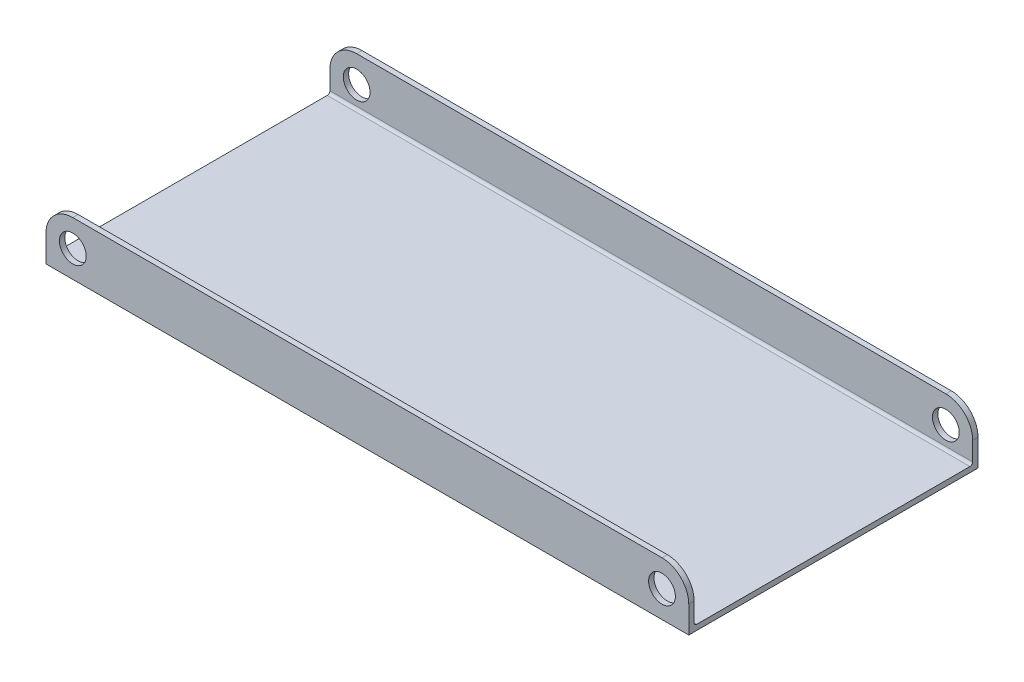
ISO-10303-21;
HEADER;
FILE_DESCRIPTION(('STEP AP214'),'2;1');
FILE_NAME('part.step','',(''),(''),'','','');
FILE_SCHEMA(('AUTOMOTIVE_DESIGN { 1 0 10303 214 1 1 1 1 }'));
ENDSEC;
DATA;
#1=APPLICATION_CONTEXT('core data for automotive mechanical design processes');
#2=APPLICATION_PROTOCOL_DEFINITION('international standard','automotive_design',2000,#1);
#3=PRODUCT_CONTEXT('',#1,'mechanical');
#4=PRODUCT('Part','Part','',(#3));
#5=PRODUCT_RELATED_PRODUCT_CATEGORY('part','',(#4));
#6=PRODUCT_DEFINITION_FORMATION('','',#4);
#7=PRODUCT_DEFINITION_CONTEXT('part definition',#1,'design');
#8=PRODUCT_DEFINITION('design','',#6,#7);
#9=PRODUCT_DEFINITION_SHAPE('','',#8);
#10=(LENGTH_UNIT() NAMED_UNIT(*) SI_UNIT(.MILLI.,.METRE.));
#11=(NAMED_UNIT(*) PLANE_ANGLE_UNIT() SI_UNIT($,.RADIAN.));
#12=(NAMED_UNIT(*) SI_UNIT($,.STERADIAN.) SOLID_ANGLE_UNIT());
#13=UNCERTAINTY_MEASURE_WITH_UNIT(LENGTH_MEASURE(1.E-05),#10,'distance_accuracy_value','');
#14=(GEOMETRIC_REPRESENTATION_CONTEXT(3) GLOBAL_UNCERTAINTY_ASSIGNED_CONTEXT((#13)) GLOBAL_UNIT_ASSIGNED_CONTEXT((#10,
#11,#12)) REPRESENTATION_CONTEXT('',''));
#15=CARTESIAN_POINT('',(0.,0.,0.));
#16=DIRECTION('',(0.,0.,1.));
#17=DIRECTION('',(1.,0.,0.));
#18=AXIS2_PLACEMENT_3D('',#15,#16,#17);
#19=CARTESIAN_POINT('',(0.,12.7,0.));
#20=DIRECTION('',(0.,1.,0.));
#21=DIRECTION('',(0.,0.,1.));
#22=AXIS2_PLACEMENT_3D('',#19,#20,#21);
#23=PLANE('',#22);
#24=DIRECTION('',(1.,0.,0.));
#25=VECTOR('',#24,1.);
#26=CARTESIAN_POINT('',(0.,12.7,-33.02));
#27=LINE('',#26,#25);
#28=CARTESIAN_POINT('',(-69.8499999999999,12.7,-33.02));
#29=VERTEX_POINT('',#28);
#30=CARTESIAN_POINT('',(69.85,12.7,-33.02));
#31=VERTEX_POINT('',#30);
#32=EDGE_CURVE('E176',#29,#31,#27,.T.);
#33=ORIENTED_EDGE('',*,*,#32,.T.);
#34=DIRECTION('',(0.,0.,1.));
#35=VECTOR('',#34,1.);
#36=CARTESIAN_POINT('',(69.85,12.7,-34.29));
#37=LINE('',#36,#35);
#38=CARTESIAN_POINT('',(69.85,12.7,-34.29));
#39=VERTEX_POINT('',#38);
#40=EDGE_CURVE('E160',#39,#31,#37,.T.);
#41=ORIENTED_EDGE('',*,*,#40,.F.);
#42=DIRECTION('',(-1.,0.,0.));
#43=VECTOR('',#42,1.);
#44=CARTESIAN_POINT('',(-76.2,12.7,-34.29));
#45=LINE('',#44,#43);
#46=CARTESIAN_POINT('',(-69.8499999999999,12.7,-34.29));
#47=VERTEX_POINT('',#46);
#48=EDGE_CURVE('E173',#39,#47,#45,.T.);
#49=ORIENTED_EDGE('',*,*,#48,.T.);
#50=DIRECTION('',(0.,0.,1.));
#51=VECTOR('',#50,1.);
#52=CARTESIAN_POINT('',(-69.8499999999999,12.7,-34.29));
#53=LINE('',#52,#51);
#54=EDGE_CURVE('E274',#47,#29,#53,.T.);
#55=ORIENTED_EDGE('',*,*,#54,.T.);
#56=EDGE_LOOP('',(#33,#41,#49,#55));
#57=FACE_BOUND('',#56,.T.);
#58=ADVANCED_FACE('F57',(#57),#23,.T.);
#59=CARTESIAN_POINT('',(-76.2,12.7,-34.29));
#60=DIRECTION('',(0.,0.,1.));
#61=DIRECTION('',(1.,0.,0.));
#62=AXIS2_PLACEMENT_3D('',#59,#60,#61);
#63=PLANE('',#62);
#64=ORIENTED_EDGE('',*,*,#48,.F.);
#65=CARTESIAN_POINT('',(69.85,6.35,-34.29));
#66=DIRECTION('',(0.,0.,1.));
#67=DIRECTION('',(1.,0.,0.));
#68=AXIS2_PLACEMENT_3D('',#65,#66,#67);
#69=CIRCLE('',#68,6.35);
#70=CARTESIAN_POINT('',(76.2,6.34999999999995,-34.29));
#71=VERTEX_POINT('',#70);
#72=EDGE_CURVE('E156',#39,#71,#69,.F.);
#73=ORIENTED_EDGE('',*,*,#72,.T.);
#74=DIRECTION('',(0.,-1.,0.));
#75=VECTOR('',#74,1.);
#76=CARTESIAN_POINT('',(76.2,12.7,-34.29));
#77=LINE('',#76,#75);
#78=CARTESIAN_POINT('',(76.2,0.,-34.29));
#79=VERTEX_POINT('',#78);
#80=EDGE_CURVE('E210',#71,#79,#77,.T.);
#81=ORIENTED_EDGE('',*,*,#80,.T.);
#82=DIRECTION('',(-1.,0.,0.));
#83=VECTOR('',#82,1.);
#84=CARTESIAN_POINT('',(-76.2,0.,-34.29));
#85=LINE('',#84,#83);
#86=CARTESIAN_POINT('',(-76.2,0.,-34.29));
#87=VERTEX_POINT('',#86);
#88=EDGE_CURVE('E199',#79,#87,#85,.T.);
#89=ORIENTED_EDGE('',*,*,#88,.T.);
#90=DIRECTION('',(0.,-1.,0.));
#91=VECTOR('',#90,1.);
#92=CARTESIAN_POINT('',(-76.2,12.7,-34.29));
#93=LINE('',#92,#91);
#94=CARTESIAN_POINT('',(-76.2,6.34999999999995,-34.29));
#95=VERTEX_POINT('',#94);
#96=EDGE_CURVE('E208',#95,#87,#93,.T.);
#97=ORIENTED_EDGE('',*,*,#96,.F.);
#98=CARTESIAN_POINT('',(-69.85,6.35,-34.29));
#99=DIRECTION('',(0.,0.,1.));
#100=DIRECTION('',(1.,0.,0.));
#101=AXIS2_PLACEMENT_3D('',#98,#99,#100);
#102=CIRCLE('',#101,6.35);
#103=EDGE_CURVE('E182',#47,#95,#102,.T.);
#104=ORIENTED_EDGE('',*,*,#103,.F.);
#105=EDGE_LOOP('',(#64,#73,#81,#89,#97,#104));
#106=FACE_BOUND('',#105,.T.);
#107=CARTESIAN_POINT('',(69.85,6.35,-34.29));
#108=DIRECTION('',(0.,0.,1.));
#109=DIRECTION('',(1.,0.,0.));
#110=AXIS2_PLACEMENT_3D('',#107,#108,#109);
#111=CIRCLE('',#110,3.17500000000005);
#112=CARTESIAN_POINT('',(73.0250000000001,6.35,-34.29));
#113=VERTEX_POINT('',#112);
#114=EDGE_CURVE('E295',#113,#113,#111,.F.);
#115=ORIENTED_EDGE('',*,*,#114,.F.);
#116=EDGE_LOOP('',(#115));
#117=FACE_BOUND('',#116,.T.);
#118=CARTESIAN_POINT('',(-69.85,6.35,-34.29));
#119=DIRECTION('',(0.,0.,1.));
#120=DIRECTION('',(1.,0.,0.));
#121=AXIS2_PLACEMENT_3D('',#118,#119,#120);
#122=CIRCLE('',#121,3.175);
#123=CARTESIAN_POINT('',(-66.675,6.35,-34.29));
#124=VERTEX_POINT('',#123);
#125=EDGE_CURVE('E291',#124,#124,#122,.T.);
#126=ORIENTED_EDGE('',*,*,#125,.T.);
#127=EDGE_LOOP('',(#126));
#128=FACE_BOUND('',#127,.T.);
#129=ADVANCED_FACE('F179',(#106,#117,#128),#63,.F.);
#130=CARTESIAN_POINT('',(-76.2,12.7,34.29));
#131=DIRECTION('',(0.,0.,-1.));
#132=DIRECTION('',(-1.,0.,0.));
#133=AXIS2_PLACEMENT_3D('',#130,#131,#132);
#134=PLANE('',#133);
#135=DIRECTION('',(0.,-1.,0.));
#136=VECTOR('',#135,1.);
#137=CARTESIAN_POINT('',(76.2,12.7,34.29));
#138=LINE('',#137,#136);
#139=CARTESIAN_POINT('',(76.2,6.34999999999995,34.29));
#140=VERTEX_POINT('',#139);
#141=CARTESIAN_POINT('',(76.2,0.,34.29));
#142=VERTEX_POINT('',#141);
#143=EDGE_CURVE('E187',#140,#142,#138,.T.);
#144=ORIENTED_EDGE('',*,*,#143,.F.);
#145=CARTESIAN_POINT('',(69.85,6.35,34.29));
#146=DIRECTION('',(0.,0.,1.));
#147=DIRECTION('',(1.,0.,0.));
#148=AXIS2_PLACEMENT_3D('',#145,#146,#147);
#149=CIRCLE('',#148,6.35);
#150=CARTESIAN_POINT('',(69.85,12.7,34.29));
#151=VERTEX_POINT('',#150);
#152=EDGE_CURVE('E168',#151,#140,#149,.F.);
#153=ORIENTED_EDGE('',*,*,#152,.F.);
#154=DIRECTION('',(1.,0.,0.));
#155=VECTOR('',#154,1.);
#156=CARTESIAN_POINT('',(-76.2,12.7,34.29));
#157=LINE('',#156,#155);
#158=CARTESIAN_POINT('',(-69.8499999999999,12.7,34.29));
#159=VERTEX_POINT('',#158);
#160=EDGE_CURVE('E183',#159,#151,#157,.T.);
#161=ORIENTED_EDGE('',*,*,#160,.F.);
#162=CARTESIAN_POINT('',(-69.85,6.35,34.29));
#163=DIRECTION('',(0.,0.,1.));
#164=DIRECTION('',(1.,0.,0.));
#165=AXIS2_PLACEMENT_3D('',#162,#163,#164);
#166=CIRCLE('',#165,6.35);
#167=CARTESIAN_POINT('',(-76.2,6.34999999999995,34.29));
#168=VERTEX_POINT('',#167);
#169=EDGE_CURVE('E279',#159,#168,#166,.T.);
#170=ORIENTED_EDGE('',*,*,#169,.T.);
#171=DIRECTION('',(0.,-1.,0.));
#172=VECTOR('',#171,1.);
#173=CARTESIAN_POINT('',(-76.2,12.7,34.29));
#174=LINE('',#173,#172);
#175=CARTESIAN_POINT('',(-76.2,0.,34.29));
#176=VERTEX_POINT('',#175);
#177=EDGE_CURVE('E206',#168,#176,#174,.T.);
#178=ORIENTED_EDGE('',*,*,#177,.T.);
#179=DIRECTION('',(1.,0.,0.));
#180=VECTOR('',#179,1.);
#181=CARTESIAN_POINT('',(-76.2,0.,34.29));
#182=LINE('',#181,#180);
#183=EDGE_CURVE('E184',#176,#142,#182,.T.);
#184=ORIENTED_EDGE('',*,*,#183,.T.);
#185=EDGE_LOOP('',(#144,#153,#161,#170,#178,#184));
#186=FACE_BOUND('',#185,.T.);
#187=CARTESIAN_POINT('',(69.85,6.35,34.29));
#188=DIRECTION('',(0.,0.,1.));
#189=DIRECTION('',(1.,0.,0.));
#190=AXIS2_PLACEMENT_3D('',#187,#188,#189);
#191=CIRCLE('',#190,3.17500000000005);
#192=CARTESIAN_POINT('',(73.0250000000001,6.35,34.29));
#193=VERTEX_POINT('',#192);
#194=EDGE_CURVE('E292',#193,#193,#191,.F.);
#195=ORIENTED_EDGE('',*,*,#194,.T.);
#196=EDGE_LOOP('',(#195));
#197=FACE_BOUND('',#196,.T.);
#198=CARTESIAN_POINT('',(-69.85,6.35,34.29));
#199=DIRECTION('',(0.,0.,1.));
#200=DIRECTION('',(1.,0.,0.));
#201=AXIS2_PLACEMENT_3D('',#198,#199,#200);
#202=CIRCLE('',#201,3.175);
#203=CARTESIAN_POINT('',(-66.675,6.35,34.29));
#204=VERTEX_POINT('',#203);
#205=EDGE_CURVE('E297',#204,#204,#202,.T.);
#206=ORIENTED_EDGE('',*,*,#205,.F.);
#207=EDGE_LOOP('',(#206));
#208=FACE_BOUND('',#207,.T.);
#209=ADVANCED_FACE('F331',(#186,#197,#208),#134,.F.);
#210=ORIENTED_EDGE('',*,*,#160,.T.);
#211=CARTESIAN_POINT('',(69.85,12.7,33.02));
#212=VERTEX_POINT('',#211);
#213=EDGE_CURVE('E167',#212,#151,#37,.T.);
#214=ORIENTED_EDGE('',*,*,#213,.F.);
#215=DIRECTION('',(1.,0.,0.));
#216=VECTOR('',#215,1.);
#217=CARTESIAN_POINT('',(0.,12.7,33.02));
#218=LINE('',#217,#216);
#219=CARTESIAN_POINT('',(-69.8499999999999,12.7,33.02));
#220=VERTEX_POINT('',#219);
#221=EDGE_CURVE('E267',#220,#212,#218,.T.);
#222=ORIENTED_EDGE('',*,*,#221,.F.);
#223=EDGE_CURVE('E277',#220,#159,#53,.T.);
#224=ORIENTED_EDGE('',*,*,#223,.T.);
#225=EDGE_LOOP('',(#210,#214,#222,#224));
#226=FACE_BOUND('',#225,.T.);
#227=ADVANCED_FACE('F327',(#226),#23,.T.);
#228=CARTESIAN_POINT('',(0.,1.27,-33.02));
#229=DIRECTION('',(0.,0.,1.));
#230=DIRECTION('',(1.,0.,0.));
#231=AXIS2_PLACEMENT_3D('',#228,#229,#230);
#232=PLANE('',#231);
#233=CARTESIAN_POINT('',(69.85,6.35,-33.02));
#234=DIRECTION('',(0.,0.,1.));
#235=DIRECTION('',(1.,0.,0.));
#236=AXIS2_PLACEMENT_3D('',#233,#234,#235);
#237=CIRCLE('',#236,3.17500000000005);
#238=CARTESIAN_POINT('',(73.0250000000001,6.35,-33.02));
#239=VERTEX_POINT('',#238);
#240=EDGE_CURVE('E222',#239,#239,#237,.F.);
#241=ORIENTED_EDGE('',*,*,#240,.T.);
#242=EDGE_LOOP('',(#241));
#243=FACE_BOUND('',#242,.T.);
#244=DIRECTION('',(0.,1.,0.));
#245=VECTOR('',#244,1.);
#246=CARTESIAN_POINT('',(-76.2,1.27,-33.02));
#247=LINE('',#246,#245);
#248=CARTESIAN_POINT('',(-76.2,1.905,-33.02));
#249=VERTEX_POINT('',#248);
#250=CARTESIAN_POINT('',(-76.2,6.34999999999995,-33.02));
#251=VERTEX_POINT('',#250);
#252=EDGE_CURVE('E193',#249,#251,#247,.T.);
#253=ORIENTED_EDGE('',*,*,#252,.F.);
#254=DIRECTION('',(1.,0.,0.));
#255=VECTOR('',#254,1.);
#256=CARTESIAN_POINT('',(76.2,1.905,-33.02));
#257=LINE('',#256,#255);
#258=CARTESIAN_POINT('',(76.2,1.905,-33.02));
#259=VERTEX_POINT('',#258);
#260=EDGE_CURVE('E234',#249,#259,#257,.T.);
#261=ORIENTED_EDGE('',*,*,#260,.T.);
#262=DIRECTION('',(0.,1.,0.));
#263=VECTOR('',#262,1.);
#264=CARTESIAN_POINT('',(76.2,1.27,-33.02));
#265=LINE('',#264,#263);
#266=CARTESIAN_POINT('',(76.2,6.35,-33.02));
#267=VERTEX_POINT('',#266);
#268=EDGE_CURVE('E200',#259,#267,#265,.T.);
#269=ORIENTED_EDGE('',*,*,#268,.T.);
#270=CARTESIAN_POINT('',(69.85,6.35,-33.02));
#271=DIRECTION('',(0.,0.,1.));
#272=DIRECTION('',(1.,0.,0.));
#273=AXIS2_PLACEMENT_3D('',#270,#271,#272);
#274=CIRCLE('',#273,6.35);
#275=EDGE_CURVE('E223',#31,#267,#274,.F.);
#276=ORIENTED_EDGE('',*,*,#275,.F.);
#277=ORIENTED_EDGE('',*,*,#32,.F.);
#278=CARTESIAN_POINT('',(-69.85,6.35,-33.02));
#279=DIRECTION('',(0.,0.,1.));
#280=DIRECTION('',(1.,0.,0.));
#281=AXIS2_PLACEMENT_3D('',#278,#279,#280);
#282=CIRCLE('',#281,6.35);
#283=EDGE_CURVE('E256',#29,#251,#282,.T.);
#284=ORIENTED_EDGE('',*,*,#283,.T.);
#285=EDGE_LOOP('',(#253,#261,#269,#276,#277,#284));
#286=FACE_BOUND('',#285,.T.);
#287=CARTESIAN_POINT('',(-69.85,6.35,-33.02));
#288=DIRECTION('',(0.,0.,1.));
#289=DIRECTION('',(1.,0.,0.));
#290=AXIS2_PLACEMENT_3D('',#287,#288,#289);
#291=CIRCLE('',#290,3.175);
#292=CARTESIAN_POINT('',(-66.675,6.35,-33.02));
#293=VERTEX_POINT('',#292);
#294=EDGE_CURVE('E227',#293,#293,#291,.T.);
#295=ORIENTED_EDGE('',*,*,#294,.F.);
#296=EDGE_LOOP('',(#295));
#297=FACE_BOUND('',#296,.T.);
#298=ADVANCED_FACE('F253',(#243,#286,#297),#232,.T.);
#299=CARTESIAN_POINT('',(0.,1.27,33.02));
#300=DIRECTION('',(0.,0.,1.));
#301=DIRECTION('',(1.,0.,0.));
#302=AXIS2_PLACEMENT_3D('',#299,#300,#301);
#303=PLANE('',#302);
#304=DIRECTION('',(0.,1.,0.));
#305=VECTOR('',#304,1.);
#306=CARTESIAN_POINT('',(76.2,1.27,33.02));
#307=LINE('',#306,#305);
#308=CARTESIAN_POINT('',(76.2,1.905,33.02));
#309=VERTEX_POINT('',#308);
#310=CARTESIAN_POINT('',(76.2,6.34999999999995,33.02));
#311=VERTEX_POINT('',#310);
#312=EDGE_CURVE('E260',#309,#311,#307,.T.);
#313=ORIENTED_EDGE('',*,*,#312,.F.);
#314=DIRECTION('',(1.,0.,0.));
#315=VECTOR('',#314,1.);
#316=CARTESIAN_POINT('',(0.,1.905,33.02));
#317=LINE('',#316,#315);
#318=CARTESIAN_POINT('',(-76.2,1.905,33.02));
#319=VERTEX_POINT('',#318);
#320=EDGE_CURVE('E232',#309,#319,#317,.F.);
#321=ORIENTED_EDGE('',*,*,#320,.T.);
#322=DIRECTION('',(0.,1.,0.));
#323=VECTOR('',#322,1.);
#324=CARTESIAN_POINT('',(-76.2,1.27,33.02));
#325=LINE('',#324,#323);
#326=CARTESIAN_POINT('',(-76.2,6.34999999999995,33.02));
#327=VERTEX_POINT('',#326);
#328=EDGE_CURVE('E259',#319,#327,#325,.T.);
#329=ORIENTED_EDGE('',*,*,#328,.T.);
#330=CARTESIAN_POINT('',(-69.85,6.35,33.02));
#331=DIRECTION('',(0.,0.,1.));
#332=DIRECTION('',(1.,0.,0.));
#333=AXIS2_PLACEMENT_3D('',#330,#331,#332);
#334=CIRCLE('',#333,6.35);
#335=EDGE_CURVE('E212',#220,#327,#334,.T.);
#336=ORIENTED_EDGE('',*,*,#335,.F.);
#337=ORIENTED_EDGE('',*,*,#221,.T.);
#338=CARTESIAN_POINT('',(69.85,6.35,33.02));
#339=DIRECTION('',(0.,0.,1.));
#340=DIRECTION('',(1.,0.,0.));
#341=AXIS2_PLACEMENT_3D('',#338,#339,#340);
#342=CIRCLE('',#341,6.35);
#343=EDGE_CURVE('E288',#212,#311,#342,.F.);
#344=ORIENTED_EDGE('',*,*,#343,.T.);
#345=EDGE_LOOP('',(#313,#321,#329,#336,#337,#344));
#346=FACE_BOUND('',#345,.T.);
#347=CARTESIAN_POINT('',(69.85,6.35,33.02));
#348=DIRECTION('',(0.,0.,1.));
#349=DIRECTION('',(1.,0.,0.));
#350=AXIS2_PLACEMENT_3D('',#347,#348,#349);
#351=CIRCLE('',#350,3.17500000000005);
#352=CARTESIAN_POINT('',(73.0250000000001,6.35,33.02));
#353=VERTEX_POINT('',#352);
#354=EDGE_CURVE('E219',#353,#353,#351,.F.);
#355=ORIENTED_EDGE('',*,*,#354,.F.);
#356=EDGE_LOOP('',(#355));
#357=FACE_BOUND('',#356,.T.);
#358=CARTESIAN_POINT('',(-69.85,6.35,33.02));
#359=DIRECTION('',(0.,0.,1.));
#360=DIRECTION('',(1.,0.,0.));
#361=AXIS2_PLACEMENT_3D('',#358,#359,#360);
#362=CIRCLE('',#361,3.175);
#363=CARTESIAN_POINT('',(-66.675,6.35,33.02));
#364=VERTEX_POINT('',#363);
#365=EDGE_CURVE('E224',#364,#364,#362,.T.);
#366=ORIENTED_EDGE('',*,*,#365,.T.);
#367=EDGE_LOOP('',(#366));
#368=FACE_BOUND('',#367,.T.);
#369=ADVANCED_FACE('F341',(#346,#357,#368),#303,.F.);
#370=CARTESIAN_POINT('',(76.2,12.7,-34.29));
#371=DIRECTION('',(-1.,0.,0.));
#372=DIRECTION('',(0.,0.,1.));
#373=AXIS2_PLACEMENT_3D('',#370,#371,#372);
#374=PLANE('',#373);
#375=DIRECTION('',(0.,0.,1.));
#376=VECTOR('',#375,1.);
#377=CARTESIAN_POINT('',(76.2,6.35,-34.29));
#378=LINE('',#377,#376);
#379=EDGE_CURVE('E215',#140,#311,#378,.F.);
#380=ORIENTED_EDGE('',*,*,#379,.F.);
#381=ORIENTED_EDGE('',*,*,#143,.T.);
#382=DIRECTION('',(0.,0.,-1.));
#383=VECTOR('',#382,1.);
#384=CARTESIAN_POINT('',(76.2,0.,-34.29));
#385=LINE('',#384,#383);
#386=EDGE_CURVE('E196',#142,#79,#385,.T.);
#387=ORIENTED_EDGE('',*,*,#386,.T.);
#388=ORIENTED_EDGE('',*,*,#80,.F.);
#389=DIRECTION('',(0.,0.,1.));
#390=VECTOR('',#389,1.);
#391=CARTESIAN_POINT('',(76.2,6.34999999999995,-34.29));
#392=LINE('',#391,#390);
#393=EDGE_CURVE('E163',#71,#267,#392,.T.);
#394=ORIENTED_EDGE('',*,*,#393,.T.);
#395=ORIENTED_EDGE('',*,*,#268,.F.);
#396=CARTESIAN_POINT('',(76.2,1.905,-32.385));
#397=DIRECTION('',(-1.,0.,0.));
#398=DIRECTION('',(0.,0.,1.));
#399=AXIS2_PLACEMENT_3D('',#396,#397,#398);
#400=CIRCLE('',#399,0.635);
#401=CARTESIAN_POINT('',(76.2,1.27,-32.385));
#402=VERTEX_POINT('',#401);
#403=EDGE_CURVE('E65',#259,#402,#400,.T.);
#404=ORIENTED_EDGE('',*,*,#403,.T.);
#405=DIRECTION('',(0.,0.,-1.));
#406=VECTOR('',#405,1.);
#407=CARTESIAN_POINT('',(76.2,1.27,0.));
#408=LINE('',#407,#406);
#409=CARTESIAN_POINT('',(76.2,1.27,32.385));
#410=VERTEX_POINT('',#409);
#411=EDGE_CURVE('E245',#410,#402,#408,.T.);
#412=ORIENTED_EDGE('',*,*,#411,.F.);
#413=CARTESIAN_POINT('',(76.2,1.905,32.385));
#414=DIRECTION('',(-1.,0.,0.));
#415=DIRECTION('',(0.,0.,1.));
#416=AXIS2_PLACEMENT_3D('',#413,#414,#415);
#417=CIRCLE('',#416,0.635);
#418=EDGE_CURVE('E236',#410,#309,#417,.T.);
#419=ORIENTED_EDGE('',*,*,#418,.T.);
#420=ORIENTED_EDGE('',*,*,#312,.T.);
#421=EDGE_LOOP('',(#380,#381,#387,#388,#394,#395,#404,#412,#419,#420));
#422=FACE_BOUND('',#421,.T.);
#423=ADVANCED_FACE('F244',(#422),#374,.F.);
#424=CARTESIAN_POINT('',(-76.2,12.7,-34.29));
#425=DIRECTION('',(1.,0.,0.));
#426=DIRECTION('',(0.,0.,-1.));
#427=AXIS2_PLACEMENT_3D('',#424,#425,#426);
#428=PLANE('',#427);
#429=DIRECTION('',(0.,0.,1.));
#430=VECTOR('',#429,1.);
#431=CARTESIAN_POINT('',(-76.2,6.34999999999995,-34.29));
#432=LINE('',#431,#430);
#433=EDGE_CURVE('E273',#95,#251,#432,.T.);
#434=ORIENTED_EDGE('',*,*,#433,.F.);
#435=ORIENTED_EDGE('',*,*,#96,.T.);
#436=DIRECTION('',(0.,0.,1.));
#437=VECTOR('',#436,1.);
#438=CARTESIAN_POINT('',(-76.2,0.,-34.29));
#439=LINE('',#438,#437);
#440=EDGE_CURVE('E190',#87,#176,#439,.T.);
#441=ORIENTED_EDGE('',*,*,#440,.T.);
#442=ORIENTED_EDGE('',*,*,#177,.F.);
#443=EDGE_CURVE('E276',#327,#168,#432,.T.);
#444=ORIENTED_EDGE('',*,*,#443,.F.);
#445=ORIENTED_EDGE('',*,*,#328,.F.);
#446=CARTESIAN_POINT('',(-76.2,1.905,32.385));
#447=DIRECTION('',(1.,0.,0.));
#448=DIRECTION('',(0.,0.,-1.));
#449=AXIS2_PLACEMENT_3D('',#446,#447,#448);
#450=CIRCLE('',#449,0.635);
#451=CARTESIAN_POINT('',(-76.2,1.27,32.385));
#452=VERTEX_POINT('',#451);
#453=EDGE_CURVE('E238',#319,#452,#450,.T.);
#454=ORIENTED_EDGE('',*,*,#453,.T.);
#455=DIRECTION('',(0.,0.,1.));
#456=VECTOR('',#455,1.);
#457=CARTESIAN_POINT('',(-76.2,1.27,0.));
#458=LINE('',#457,#456);
#459=CARTESIAN_POINT('',(-76.2,1.27,-32.385));
#460=VERTEX_POINT('',#459);
#461=EDGE_CURVE('E250',#460,#452,#458,.T.);
#462=ORIENTED_EDGE('',*,*,#461,.F.);
#463=CARTESIAN_POINT('',(-76.2,1.905,-32.385));
#464=DIRECTION('',(1.,0.,0.));
#465=DIRECTION('',(0.,0.,-1.));
#466=AXIS2_PLACEMENT_3D('',#463,#464,#465);
#467=CIRCLE('',#466,0.635);
#468=EDGE_CURVE('E12',#460,#249,#467,.T.);
#469=ORIENTED_EDGE('',*,*,#468,.T.);
#470=ORIENTED_EDGE('',*,*,#252,.T.);
#471=EDGE_LOOP('',(#434,#435,#441,#442,#444,#445,#454,#462,#469,#470));
#472=FACE_BOUND('',#471,.T.);
#473=ADVANCED_FACE('F359',(#472),#428,.F.);
#474=CARTESIAN_POINT('',(0.,0.,0.));
#475=DIRECTION('',(0.,1.,0.));
#476=DIRECTION('',(0.,0.,1.));
#477=AXIS2_PLACEMENT_3D('',#474,#475,#476);
#478=PLANE('',#477);
#479=ORIENTED_EDGE('',*,*,#386,.F.);
#480=ORIENTED_EDGE('',*,*,#183,.F.);
#481=ORIENTED_EDGE('',*,*,#440,.F.);
#482=ORIENTED_EDGE('',*,*,#88,.F.);
#483=EDGE_LOOP('',(#479,#480,#481,#482));
#484=FACE_BOUND('',#483,.T.);
#485=ADVANCED_FACE('F371',(#484),#478,.F.);
#486=CARTESIAN_POINT('',(0.,1.27,0.));
#487=DIRECTION('',(0.,1.,0.));
#488=DIRECTION('',(0.,0.,1.));
#489=AXIS2_PLACEMENT_3D('',#486,#487,#488);
#490=PLANE('',#489);
#491=ORIENTED_EDGE('',*,*,#461,.T.);
#492=DIRECTION('',(1.,0.,0.));
#493=VECTOR('',#492,1.);
#494=CARTESIAN_POINT('',(0.,1.27,32.385));
#495=LINE('',#494,#493);
#496=EDGE_CURVE('E229',#452,#410,#495,.T.);
#497=ORIENTED_EDGE('',*,*,#496,.T.);
#498=ORIENTED_EDGE('',*,*,#411,.T.);
#499=DIRECTION('',(1.,0.,0.));
#500=VECTOR('',#499,1.);
#501=CARTESIAN_POINT('',(-76.2,1.27,-32.385));
#502=LINE('',#501,#500);
#503=EDGE_CURVE('E218',#402,#460,#502,.F.);
#504=ORIENTED_EDGE('',*,*,#503,.T.);
#505=EDGE_LOOP('',(#491,#497,#498,#504));
#506=FACE_BOUND('',#505,.T.);
#507=ADVANCED_FACE('F248',(#506),#490,.T.);
#508=CARTESIAN_POINT('',(-69.85,6.35,-34.29));
#509=DIRECTION('',(0.,0.,1.));
#510=DIRECTION('',(1.,0.,0.));
#511=AXIS2_PLACEMENT_3D('',#508,#509,#510);
#512=CYLINDRICAL_SURFACE('',#511,6.35);
#513=ORIENTED_EDGE('',*,*,#335,.T.);
#514=ORIENTED_EDGE('',*,*,#443,.T.);
#515=ORIENTED_EDGE('',*,*,#169,.F.);
#516=ORIENTED_EDGE('',*,*,#223,.F.);
#517=EDGE_LOOP('',(#513,#514,#515,#516));
#518=FACE_BOUND('',#517,.T.);
#519=ADVANCED_FACE('F362',(#518),#512,.T.);
#520=ORIENTED_EDGE('',*,*,#54,.F.);
#521=ORIENTED_EDGE('',*,*,#103,.T.);
#522=ORIENTED_EDGE('',*,*,#433,.T.);
#523=ORIENTED_EDGE('',*,*,#283,.F.);
#524=EDGE_LOOP('',(#520,#521,#522,#523));
#525=FACE_BOUND('',#524,.T.);
#526=ADVANCED_FACE('F364',(#525),#512,.T.);
#527=CARTESIAN_POINT('',(69.85,6.35,-34.29));
#528=DIRECTION('',(0.,0.,1.));
#529=DIRECTION('',(1.,0.,0.));
#530=AXIS2_PLACEMENT_3D('',#527,#528,#529);
#531=CYLINDRICAL_SURFACE('',#530,6.35);
#532=ORIENTED_EDGE('',*,*,#275,.T.);
#533=ORIENTED_EDGE('',*,*,#393,.F.);
#534=ORIENTED_EDGE('',*,*,#72,.F.);
#535=ORIENTED_EDGE('',*,*,#40,.T.);
#536=EDGE_LOOP('',(#532,#533,#534,#535));
#537=FACE_BOUND('',#536,.T.);
#538=ADVANCED_FACE('F159',(#537),#531,.T.);
#539=ORIENTED_EDGE('',*,*,#213,.T.);
#540=ORIENTED_EDGE('',*,*,#152,.T.);
#541=ORIENTED_EDGE('',*,*,#379,.T.);
#542=ORIENTED_EDGE('',*,*,#343,.F.);
#543=EDGE_LOOP('',(#539,#540,#541,#542));
#544=FACE_BOUND('',#543,.T.);
#545=ADVANCED_FACE('F354',(#544),#531,.T.);
#546=CARTESIAN_POINT('',(69.85,6.35,-34.29));
#547=DIRECTION('',(0.,0.,1.));
#548=DIRECTION('',(1.,0.,0.));
#549=AXIS2_PLACEMENT_3D('',#546,#547,#548);
#550=CYLINDRICAL_SURFACE('',#549,3.17500000000005);
#551=ORIENTED_EDGE('',*,*,#194,.F.);
#552=EDGE_LOOP('',(#551));
#553=FACE_BOUND('',#552,.T.);
#554=ORIENTED_EDGE('',*,*,#354,.T.);
#555=EDGE_LOOP('',(#554));
#556=FACE_BOUND('',#555,.T.);
#557=ADVANCED_FACE('F321',(#553,#556),#550,.F.);
#558=CARTESIAN_POINT('',(-69.85,6.35,-34.29));
#559=DIRECTION('',(0.,0.,1.));
#560=DIRECTION('',(1.,0.,0.));
#561=AXIS2_PLACEMENT_3D('',#558,#559,#560);
#562=CYLINDRICAL_SURFACE('',#561,3.175);
#563=ORIENTED_EDGE('',*,*,#205,.T.);
#564=EDGE_LOOP('',(#563));
#565=FACE_BOUND('',#564,.T.);
#566=ORIENTED_EDGE('',*,*,#365,.F.);
#567=EDGE_LOOP('',(#566));
#568=FACE_BOUND('',#567,.T.);
#569=ADVANCED_FACE('F313',(#565,#568),#562,.F.);
#570=ORIENTED_EDGE('',*,*,#240,.F.);
#571=EDGE_LOOP('',(#570));
#572=FACE_BOUND('',#571,.T.);
#573=ORIENTED_EDGE('',*,*,#114,.T.);
#574=EDGE_LOOP('',(#573));
#575=FACE_BOUND('',#574,.T.);
#576=ADVANCED_FACE('F310',(#572,#575),#550,.F.);
#577=ORIENTED_EDGE('',*,*,#294,.T.);
#578=EDGE_LOOP('',(#577));
#579=FACE_BOUND('',#578,.T.);
#580=ORIENTED_EDGE('',*,*,#125,.F.);
#581=EDGE_LOOP('',(#580));
#582=FACE_BOUND('',#581,.T.);
#583=ADVANCED_FACE('F307',(#579,#582),#562,.F.);
#584=CARTESIAN_POINT('',(0.,1.905,32.385));
#585=DIRECTION('',(1.,0.,0.));
#586=DIRECTION('',(0.,0.,-1.));
#587=AXIS2_PLACEMENT_3D('',#584,#585,#586);
#588=CYLINDRICAL_SURFACE('',#587,0.635);
#589=ORIENTED_EDGE('',*,*,#453,.F.);
#590=ORIENTED_EDGE('',*,*,#320,.F.);
#591=ORIENTED_EDGE('',*,*,#418,.F.);
#592=ORIENTED_EDGE('',*,*,#496,.F.);
#593=EDGE_LOOP('',(#589,#590,#591,#592));
#594=FACE_BOUND('',#593,.T.);
#595=ADVANCED_FACE('F309',(#594),#588,.F.);
#596=CARTESIAN_POINT('',(0.,1.905,-32.385));
#597=DIRECTION('',(-1.,0.,0.));
#598=DIRECTION('',(0.,0.,1.));
#599=AXIS2_PLACEMENT_3D('',#596,#597,#598);
#600=CYLINDRICAL_SURFACE('',#599,0.635);
#601=ORIENTED_EDGE('',*,*,#468,.F.);
#602=ORIENTED_EDGE('',*,*,#503,.F.);
#603=ORIENTED_EDGE('',*,*,#403,.F.);
#604=ORIENTED_EDGE('',*,*,#260,.F.);
#605=EDGE_LOOP('',(#601,#602,#603,#604));
#606=FACE_BOUND('',#605,.T.);
#607=ADVANCED_FACE('F59',(#606),#600,.F.);
#608=CLOSED_SHELL('',(#58,#129,#209,#227,#298,#369,#423,#473,#485,#507,#519,#526,#538,#545,#557,
#569,#576,#583,#595,#607));
#609=MANIFOLD_SOLID_BREP('B2',#608);
#610=ADVANCED_BREP_SHAPE_REPRESENTATION('',(#18,#609),#14);
#611=SHAPE_DEFINITION_REPRESENTATION(#9,#610);
ENDSEC;
END-ISO-10303-21;
